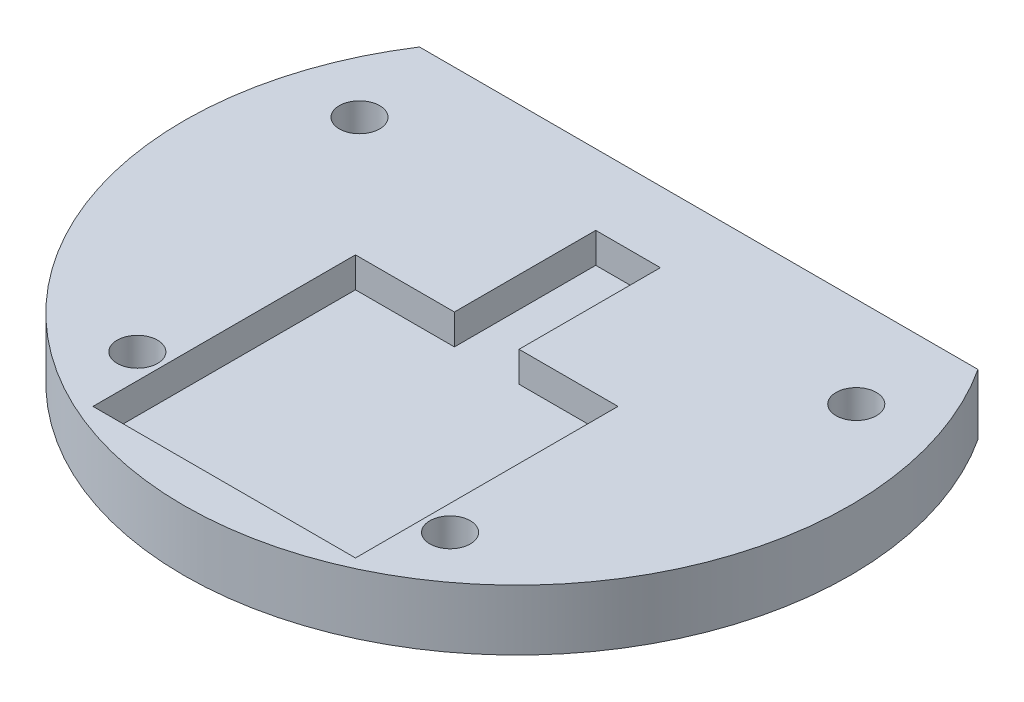
ISO-10303-21;
HEADER;
FILE_DESCRIPTION(('STEP AP214'),'2;1');
FILE_NAME('part.step','',(''),(''),'','','');
FILE_SCHEMA(('AUTOMOTIVE_DESIGN { 1 0 10303 214 1 1 1 1 }'));
ENDSEC;
DATA;
#1=APPLICATION_CONTEXT('core data for automotive mechanical design processes');
#2=APPLICATION_PROTOCOL_DEFINITION('international standard','automotive_design',2000,#1);
#3=PRODUCT_CONTEXT('',#1,'mechanical');
#4=PRODUCT('Part','Part','',(#3));
#5=PRODUCT_RELATED_PRODUCT_CATEGORY('part','',(#4));
#6=PRODUCT_DEFINITION_FORMATION('','',#4);
#7=PRODUCT_DEFINITION_CONTEXT('part definition',#1,'design');
#8=PRODUCT_DEFINITION('design','',#6,#7);
#9=PRODUCT_DEFINITION_SHAPE('','',#8);
#10=(LENGTH_UNIT() NAMED_UNIT(*) SI_UNIT(.MILLI.,.METRE.));
#11=(NAMED_UNIT(*) PLANE_ANGLE_UNIT() SI_UNIT($,.RADIAN.));
#12=(NAMED_UNIT(*) SI_UNIT($,.STERADIAN.) SOLID_ANGLE_UNIT());
#13=UNCERTAINTY_MEASURE_WITH_UNIT(LENGTH_MEASURE(1.E-05),#10,'distance_accuracy_value','');
#14=(GEOMETRIC_REPRESENTATION_CONTEXT(3) GLOBAL_UNCERTAINTY_ASSIGNED_CONTEXT((#13)) GLOBAL_UNIT_ASSIGNED_CONTEXT((#10,
#11,#12)) REPRESENTATION_CONTEXT('',''));
#15=CARTESIAN_POINT('',(0.,0.,0.));
#16=DIRECTION('',(0.,0.,1.));
#17=DIRECTION('',(1.,0.,0.));
#18=AXIS2_PLACEMENT_3D('',#15,#16,#17);
#19=CARTESIAN_POINT('',(6.5,1.5,1.5));
#20=DIRECTION('',(0.,0.,-1.));
#21=DIRECTION('',(-1.,0.,0.));
#22=AXIS2_PLACEMENT_3D('',#19,#20,#21);
#23=PLANE('',#22);
#24=DIRECTION('',(-1.,0.,0.));
#25=VECTOR('',#24,1.);
#26=CARTESIAN_POINT('',(6.5,3.,1.5));
#27=LINE('',#26,#25);
#28=CARTESIAN_POINT('',(6.5,3.,1.5));
#29=VERTEX_POINT('',#28);
#30=CARTESIAN_POINT('',(1.6,3.,1.5));
#31=VERTEX_POINT('',#30);
#32=EDGE_CURVE('E164',#29,#31,#27,.T.);
#33=ORIENTED_EDGE('',*,*,#32,.T.);
#34=DIRECTION('',(0.,1.,0.));
#35=VECTOR('',#34,1.);
#36=CARTESIAN_POINT('',(1.6,-6.19675256195754,1.5));
#37=LINE('',#36,#35);
#38=CARTESIAN_POINT('',(1.6,1.5,1.5));
#39=VERTEX_POINT('',#38);
#40=EDGE_CURVE('E186',#39,#31,#37,.T.);
#41=ORIENTED_EDGE('',*,*,#40,.F.);
#42=DIRECTION('',(-1.,0.,0.));
#43=VECTOR('',#42,1.);
#44=CARTESIAN_POINT('',(6.5,1.5,1.5));
#45=LINE('',#44,#43);
#46=CARTESIAN_POINT('',(6.5,1.5,1.5));
#47=VERTEX_POINT('',#46);
#48=EDGE_CURVE('E156',#47,#39,#45,.T.);
#49=ORIENTED_EDGE('',*,*,#48,.F.);
#50=DIRECTION('',(0.,1.,0.));
#51=VECTOR('',#50,1.);
#52=CARTESIAN_POINT('',(6.5,1.5,1.5));
#53=LINE('',#52,#51);
#54=EDGE_CURVE('E143',#47,#29,#53,.T.);
#55=ORIENTED_EDGE('',*,*,#54,.T.);
#56=EDGE_LOOP('',(#33,#41,#49,#55));
#57=FACE_BOUND('',#56,.T.);
#58=ADVANCED_FACE('F41',(#57),#23,.F.);
#59=CARTESIAN_POINT('',(0.,3.,0.));
#60=DIRECTION('',(0.,-1.,0.));
#61=DIRECTION('',(0.,0.,-1.));
#62=AXIS2_PLACEMENT_3D('',#59,#60,#61);
#63=CYLINDRICAL_SURFACE('',#62,16.5);
#64=CARTESIAN_POINT('',(0.,0.,0.));
#65=DIRECTION('',(0.,1.,0.));
#66=DIRECTION('',(0.,0.,1.));
#67=AXIS2_PLACEMENT_3D('',#64,#65,#66);
#68=CIRCLE('',#67,16.5);
#69=CARTESIAN_POINT('',(-13.8293166859393,0.,-9.));
#70=VERTEX_POINT('',#69);
#71=CARTESIAN_POINT('',(13.8293166859393,0.,-9.));
#72=VERTEX_POINT('',#71);
#73=EDGE_CURVE('E45',#70,#72,#68,.T.);
#74=ORIENTED_EDGE('',*,*,#73,.T.);
#75=DIRECTION('',(0.,1.,0.));
#76=VECTOR('',#75,1.);
#77=CARTESIAN_POINT('',(13.8293166859393,0.,-9.));
#78=LINE('',#77,#76);
#79=CARTESIAN_POINT('',(13.8293166859393,3.,-9.));
#80=VERTEX_POINT('',#79);
#81=EDGE_CURVE('E56',#72,#80,#78,.T.);
#82=ORIENTED_EDGE('',*,*,#81,.T.);
#83=CARTESIAN_POINT('',(0.,3.,0.));
#84=DIRECTION('',(0.,1.,0.));
#85=DIRECTION('',(0.,0.,1.));
#86=AXIS2_PLACEMENT_3D('',#83,#84,#85);
#87=CIRCLE('',#86,16.5);
#88=CARTESIAN_POINT('',(-13.8293166859393,3.,-9.));
#89=VERTEX_POINT('',#88);
#90=EDGE_CURVE('E11',#89,#80,#87,.T.);
#91=ORIENTED_EDGE('',*,*,#90,.F.);
#92=DIRECTION('',(0.,1.,0.));
#93=VECTOR('',#92,1.);
#94=CARTESIAN_POINT('',(-13.8293166859393,0.,-9.));
#95=LINE('',#94,#93);
#96=EDGE_CURVE('E118',#70,#89,#95,.T.);
#97=ORIENTED_EDGE('',*,*,#96,.F.);
#98=EDGE_LOOP('',(#74,#82,#91,#97));
#99=FACE_BOUND('',#98,.T.);
#100=ADVANCED_FACE('F43',(#99),#63,.T.);
#101=CARTESIAN_POINT('',(0.,3.,0.));
#102=DIRECTION('',(0.,1.,0.));
#103=DIRECTION('',(0.,0.,1.));
#104=AXIS2_PLACEMENT_3D('',#101,#102,#103);
#105=PLANE('',#104);
#106=DIRECTION('',(1.,0.,0.));
#107=VECTOR('',#106,1.);
#108=CARTESIAN_POINT('',(13.8293166859393,3.,-9.));
#109=LINE('',#108,#107);
#110=EDGE_CURVE('E123',#89,#80,#109,.T.);
#111=ORIENTED_EDGE('',*,*,#110,.F.);
#112=ORIENTED_EDGE('',*,*,#90,.T.);
#113=EDGE_LOOP('',(#111,#112));
#114=FACE_BOUND('',#113,.T.);
#115=CARTESIAN_POINT('',(12.3,3.,-4.50000000000001));
#116=DIRECTION('',(0.,-1.,0.));
#117=DIRECTION('',(0.,0.,-1.));
#118=AXIS2_PLACEMENT_3D('',#115,#116,#117);
#119=CIRCLE('',#118,1.);
#120=CARTESIAN_POINT('',(12.3,3.,-5.50000000000002));
#121=VERTEX_POINT('',#120);
#122=EDGE_CURVE('E250',#121,#121,#119,.T.);
#123=ORIENTED_EDGE('',*,*,#122,.T.);
#124=EDGE_LOOP('',(#123));
#125=FACE_BOUND('',#124,.T.);
#126=CARTESIAN_POINT('',(-12.3,3.,-4.50000000000001));
#127=DIRECTION('',(0.,-1.,0.));
#128=DIRECTION('',(0.,0.,-1.));
#129=AXIS2_PLACEMENT_3D('',#126,#127,#128);
#130=CIRCLE('',#129,1.);
#131=CARTESIAN_POINT('',(-12.3,3.,-5.50000000000001));
#132=VERTEX_POINT('',#131);
#133=EDGE_CURVE('E253',#132,#132,#130,.T.);
#134=ORIENTED_EDGE('',*,*,#133,.T.);
#135=EDGE_LOOP('',(#134));
#136=FACE_BOUND('',#135,.T.);
#137=CARTESIAN_POINT('',(-7.74328189073907,3.,11.0585525979015));
#138=DIRECTION('',(0.,-1.,0.));
#139=DIRECTION('',(0.,0.,-1.));
#140=AXIS2_PLACEMENT_3D('',#137,#138,#139);
#141=CIRCLE('',#140,0.999999999999999);
#142=CARTESIAN_POINT('',(-7.74328189073907,3.,10.0585525979015));
#143=VERTEX_POINT('',#142);
#144=EDGE_CURVE('E249',#143,#143,#141,.T.);
#145=ORIENTED_EDGE('',*,*,#144,.T.);
#146=EDGE_LOOP('',(#145));
#147=FACE_BOUND('',#146,.T.);
#148=CARTESIAN_POINT('',(7.74328189073917,3.,11.0585525979014));
#149=DIRECTION('',(0.,-1.,0.));
#150=DIRECTION('',(0.,0.,-1.));
#151=AXIS2_PLACEMENT_3D('',#148,#149,#150);
#152=CIRCLE('',#151,0.999999999999999);
#153=CARTESIAN_POINT('',(7.74328189073917,3.,10.0585525979014));
#154=VERTEX_POINT('',#153);
#155=EDGE_CURVE('E246',#154,#154,#152,.T.);
#156=ORIENTED_EDGE('',*,*,#155,.T.);
#157=EDGE_LOOP('',(#156));
#158=FACE_BOUND('',#157,.T.);
#159=DIRECTION('',(0.,0.,-1.));
#160=VECTOR('',#159,1.);
#161=CARTESIAN_POINT('',(1.6,3.,1.5));
#162=LINE('',#161,#160);
#163=CARTESIAN_POINT('',(1.6,3.,-5.5));
#164=VERTEX_POINT('',#163);
#165=EDGE_CURVE('E204',#31,#164,#162,.T.);
#166=ORIENTED_EDGE('',*,*,#165,.F.);
#167=ORIENTED_EDGE('',*,*,#32,.F.);
#168=DIRECTION('',(0.,0.,-1.));
#169=VECTOR('',#168,1.);
#170=CARTESIAN_POINT('',(6.5,3.,14.5));
#171=LINE('',#170,#169);
#172=CARTESIAN_POINT('',(6.5,3.,14.5));
#173=VERTEX_POINT('',#172);
#174=EDGE_CURVE('E160',#173,#29,#171,.T.);
#175=ORIENTED_EDGE('',*,*,#174,.F.);
#176=DIRECTION('',(-1.,0.,0.));
#177=VECTOR('',#176,1.);
#178=CARTESIAN_POINT('',(6.5,3.,14.5));
#179=LINE('',#178,#177);
#180=CARTESIAN_POINT('',(-6.5,3.,14.5));
#181=VERTEX_POINT('',#180);
#182=EDGE_CURVE('E138',#173,#181,#179,.T.);
#183=ORIENTED_EDGE('',*,*,#182,.T.);
#184=DIRECTION('',(0.,0.,-1.));
#185=VECTOR('',#184,1.);
#186=CARTESIAN_POINT('',(-6.5,3.,14.5));
#187=LINE('',#186,#185);
#188=CARTESIAN_POINT('',(-6.5,3.,1.5));
#189=VERTEX_POINT('',#188);
#190=EDGE_CURVE('E165',#181,#189,#187,.T.);
#191=ORIENTED_EDGE('',*,*,#190,.T.);
#192=CARTESIAN_POINT('',(-1.6,3.,1.5));
#193=VERTEX_POINT('',#192);
#194=EDGE_CURVE('E162',#193,#189,#27,.T.);
#195=ORIENTED_EDGE('',*,*,#194,.F.);
#196=DIRECTION('',(0.,0.,1.));
#197=VECTOR('',#196,1.);
#198=CARTESIAN_POINT('',(-1.6,3.,1.5));
#199=LINE('',#198,#197);
#200=CARTESIAN_POINT('',(-1.6,3.,-5.5));
#201=VERTEX_POINT('',#200);
#202=EDGE_CURVE('E196',#201,#193,#199,.T.);
#203=ORIENTED_EDGE('',*,*,#202,.F.);
#204=DIRECTION('',(-1.,0.,0.));
#205=VECTOR('',#204,1.);
#206=CARTESIAN_POINT('',(1.6,3.,-5.5));
#207=LINE('',#206,#205);
#208=EDGE_CURVE('E202',#164,#201,#207,.T.);
#209=ORIENTED_EDGE('',*,*,#208,.F.);
#210=EDGE_LOOP('',(#166,#167,#175,#183,#191,#195,#203,#209));
#211=FACE_BOUND('',#210,.T.);
#212=ADVANCED_FACE('F260',(#114,#125,#136,#147,#158,#211),#105,.T.);
#213=CARTESIAN_POINT('',(0.,0.,0.));
#214=DIRECTION('',(0.,1.,0.));
#215=DIRECTION('',(0.,0.,1.));
#216=AXIS2_PLACEMENT_3D('',#213,#214,#215);
#217=PLANE('',#216);
#218=CARTESIAN_POINT('',(12.3,0.,-4.50000000000001));
#219=DIRECTION('',(0.,-1.,0.));
#220=DIRECTION('',(0.,0.,-1.));
#221=AXIS2_PLACEMENT_3D('',#218,#219,#220);
#222=CIRCLE('',#221,1.5);
#223=CARTESIAN_POINT('',(12.3,0.,-6.00000000000001));
#224=VERTEX_POINT('',#223);
#225=EDGE_CURVE('E220',#224,#224,#222,.T.);
#226=ORIENTED_EDGE('',*,*,#225,.F.);
#227=EDGE_LOOP('',(#226));
#228=FACE_BOUND('',#227,.T.);
#229=CARTESIAN_POINT('',(-12.3,0.,-4.50000000000001));
#230=DIRECTION('',(0.,-1.,0.));
#231=DIRECTION('',(0.,0.,-1.));
#232=AXIS2_PLACEMENT_3D('',#229,#230,#231);
#233=CIRCLE('',#232,1.5);
#234=CARTESIAN_POINT('',(-12.3,0.,-6.00000000000001));
#235=VERTEX_POINT('',#234);
#236=EDGE_CURVE('E227',#235,#235,#233,.T.);
#237=ORIENTED_EDGE('',*,*,#236,.F.);
#238=EDGE_LOOP('',(#237));
#239=FACE_BOUND('',#238,.T.);
#240=CARTESIAN_POINT('',(-7.74328189073907,0.,11.0585525979015));
#241=DIRECTION('',(0.,-1.,0.));
#242=DIRECTION('',(0.,0.,-1.));
#243=AXIS2_PLACEMENT_3D('',#240,#241,#242);
#244=CIRCLE('',#243,1.5);
#245=CARTESIAN_POINT('',(-7.74328189073907,0.,9.55855259790145));
#246=VERTEX_POINT('',#245);
#247=EDGE_CURVE('E214',#246,#246,#244,.T.);
#248=ORIENTED_EDGE('',*,*,#247,.F.);
#249=EDGE_LOOP('',(#248));
#250=FACE_BOUND('',#249,.T.);
#251=CARTESIAN_POINT('',(7.74328189073917,0.,11.0585525979014));
#252=DIRECTION('',(0.,-1.,0.));
#253=DIRECTION('',(0.,0.,-1.));
#254=AXIS2_PLACEMENT_3D('',#251,#252,#253);
#255=CIRCLE('',#254,1.5);
#256=CARTESIAN_POINT('',(7.74328189073917,0.,9.55855259790141));
#257=VERTEX_POINT('',#256);
#258=EDGE_CURVE('E211',#257,#257,#255,.T.);
#259=ORIENTED_EDGE('',*,*,#258,.F.);
#260=EDGE_LOOP('',(#259));
#261=FACE_BOUND('',#260,.T.);
#262=ORIENTED_EDGE('',*,*,#73,.F.);
#263=DIRECTION('',(1.,0.,0.));
#264=VECTOR('',#263,1.);
#265=CARTESIAN_POINT('',(13.8293166859393,0.,-9.));
#266=LINE('',#265,#264);
#267=EDGE_CURVE('E115',#70,#72,#266,.T.);
#268=ORIENTED_EDGE('',*,*,#267,.T.);
#269=EDGE_LOOP('',(#262,#268));
#270=FACE_BOUND('',#269,.T.);
#271=ADVANCED_FACE('F128',(#228,#239,#250,#261,#270),#217,.F.);
#272=CARTESIAN_POINT('',(6.5,1.5,14.5));
#273=DIRECTION('',(1.,0.,0.));
#274=DIRECTION('',(0.,0.,-1.));
#275=AXIS2_PLACEMENT_3D('',#272,#273,#274);
#276=PLANE('',#275);
#277=ORIENTED_EDGE('',*,*,#174,.T.);
#278=ORIENTED_EDGE('',*,*,#54,.F.);
#279=DIRECTION('',(0.,0.,-1.));
#280=VECTOR('',#279,1.);
#281=CARTESIAN_POINT('',(6.5,1.5,14.5));
#282=LINE('',#281,#280);
#283=CARTESIAN_POINT('',(6.5,1.5,14.5));
#284=VERTEX_POINT('',#283);
#285=EDGE_CURVE('E171',#284,#47,#282,.T.);
#286=ORIENTED_EDGE('',*,*,#285,.F.);
#287=DIRECTION('',(0.,1.,0.));
#288=VECTOR('',#287,1.);
#289=CARTESIAN_POINT('',(6.5,1.5,14.5));
#290=LINE('',#289,#288);
#291=EDGE_CURVE('E129',#284,#173,#290,.T.);
#292=ORIENTED_EDGE('',*,*,#291,.T.);
#293=EDGE_LOOP('',(#277,#278,#286,#292));
#294=FACE_BOUND('',#293,.T.);
#295=ADVANCED_FACE('F302',(#294),#276,.F.);
#296=CARTESIAN_POINT('',(6.5,1.5,14.5));
#297=DIRECTION('',(0.,0.,-1.));
#298=DIRECTION('',(-1.,0.,0.));
#299=AXIS2_PLACEMENT_3D('',#296,#297,#298);
#300=PLANE('',#299);
#301=ORIENTED_EDGE('',*,*,#182,.F.);
#302=ORIENTED_EDGE('',*,*,#291,.F.);
#303=DIRECTION('',(-1.,0.,0.));
#304=VECTOR('',#303,1.);
#305=CARTESIAN_POINT('',(6.5,1.5,14.5));
#306=LINE('',#305,#304);
#307=CARTESIAN_POINT('',(-6.5,1.5,14.5));
#308=VERTEX_POINT('',#307);
#309=EDGE_CURVE('E145',#284,#308,#306,.T.);
#310=ORIENTED_EDGE('',*,*,#309,.T.);
#311=DIRECTION('',(0.,1.,0.));
#312=VECTOR('',#311,1.);
#313=CARTESIAN_POINT('',(-6.5,1.5,14.5));
#314=LINE('',#313,#312);
#315=EDGE_CURVE('E130',#308,#181,#314,.T.);
#316=ORIENTED_EDGE('',*,*,#315,.T.);
#317=EDGE_LOOP('',(#301,#302,#310,#316));
#318=FACE_BOUND('',#317,.T.);
#319=ADVANCED_FACE('F297',(#318),#300,.T.);
#320=CARTESIAN_POINT('',(-6.5,1.5,14.5));
#321=DIRECTION('',(1.,0.,0.));
#322=DIRECTION('',(0.,0.,-1.));
#323=AXIS2_PLACEMENT_3D('',#320,#321,#322);
#324=PLANE('',#323);
#325=ORIENTED_EDGE('',*,*,#190,.F.);
#326=ORIENTED_EDGE('',*,*,#315,.F.);
#327=DIRECTION('',(0.,0.,-1.));
#328=VECTOR('',#327,1.);
#329=CARTESIAN_POINT('',(-6.5,1.5,14.5));
#330=LINE('',#329,#328);
#331=CARTESIAN_POINT('',(-6.5,1.5,1.5));
#332=VERTEX_POINT('',#331);
#333=EDGE_CURVE('E150',#308,#332,#330,.T.);
#334=ORIENTED_EDGE('',*,*,#333,.T.);
#335=DIRECTION('',(0.,1.,0.));
#336=VECTOR('',#335,1.);
#337=CARTESIAN_POINT('',(-6.5,1.5,1.5));
#338=LINE('',#337,#336);
#339=EDGE_CURVE('E135',#332,#189,#338,.T.);
#340=ORIENTED_EDGE('',*,*,#339,.T.);
#341=EDGE_LOOP('',(#325,#326,#334,#340));
#342=FACE_BOUND('',#341,.T.);
#343=ADVANCED_FACE('F292',(#342),#324,.T.);
#344=CARTESIAN_POINT('',(-1.6,1.5,1.5));
#345=VERTEX_POINT('',#344);
#346=EDGE_CURVE('E174',#345,#332,#45,.T.);
#347=ORIENTED_EDGE('',*,*,#346,.F.);
#348=DIRECTION('',(0.,1.,0.));
#349=VECTOR('',#348,1.);
#350=CARTESIAN_POINT('',(-1.6,-6.19675256195754,1.5));
#351=LINE('',#350,#349);
#352=EDGE_CURVE('E64',#345,#193,#351,.T.);
#353=ORIENTED_EDGE('',*,*,#352,.T.);
#354=ORIENTED_EDGE('',*,*,#194,.T.);
#355=ORIENTED_EDGE('',*,*,#339,.F.);
#356=EDGE_LOOP('',(#347,#353,#354,#355));
#357=FACE_BOUND('',#356,.T.);
#358=ADVANCED_FACE('F281',(#357),#23,.F.);
#359=CARTESIAN_POINT('',(0.,1.5,0.));
#360=DIRECTION('',(0.,1.,0.));
#361=DIRECTION('',(0.,0.,1.));
#362=AXIS2_PLACEMENT_3D('',#359,#360,#361);
#363=PLANE('',#362);
#364=ORIENTED_EDGE('',*,*,#285,.T.);
#365=ORIENTED_EDGE('',*,*,#48,.T.);
#366=DIRECTION('',(0.,0.,1.));
#367=VECTOR('',#366,1.);
#368=CARTESIAN_POINT('',(1.6,1.5,1.5));
#369=LINE('',#368,#367);
#370=CARTESIAN_POINT('',(1.6,1.5,-5.5));
#371=VERTEX_POINT('',#370);
#372=EDGE_CURVE('E183',#371,#39,#369,.T.);
#373=ORIENTED_EDGE('',*,*,#372,.F.);
#374=DIRECTION('',(1.,0.,0.));
#375=VECTOR('',#374,1.);
#376=CARTESIAN_POINT('',(1.6,1.5,-5.5));
#377=LINE('',#376,#375);
#378=CARTESIAN_POINT('',(-1.6,1.5,-5.5));
#379=VERTEX_POINT('',#378);
#380=EDGE_CURVE('E163',#379,#371,#377,.T.);
#381=ORIENTED_EDGE('',*,*,#380,.F.);
#382=DIRECTION('',(0.,0.,-1.));
#383=VECTOR('',#382,1.);
#384=CARTESIAN_POINT('',(-1.6,1.5,1.5));
#385=LINE('',#384,#383);
#386=EDGE_CURVE('E190',#345,#379,#385,.T.);
#387=ORIENTED_EDGE('',*,*,#386,.F.);
#388=ORIENTED_EDGE('',*,*,#346,.T.);
#389=ORIENTED_EDGE('',*,*,#333,.F.);
#390=ORIENTED_EDGE('',*,*,#309,.F.);
#391=EDGE_LOOP('',(#364,#365,#373,#381,#387,#388,#389,#390));
#392=FACE_BOUND('',#391,.T.);
#393=ADVANCED_FACE('F181',(#392),#363,.T.);
#394=CARTESIAN_POINT('',(1.6,-6.19675256195754,1.5));
#395=DIRECTION('',(1.,0.,0.));
#396=DIRECTION('',(0.,0.,-1.));
#397=AXIS2_PLACEMENT_3D('',#394,#395,#396);
#398=PLANE('',#397);
#399=ORIENTED_EDGE('',*,*,#372,.T.);
#400=ORIENTED_EDGE('',*,*,#40,.T.);
#401=ORIENTED_EDGE('',*,*,#165,.T.);
#402=DIRECTION('',(0.,1.,0.));
#403=VECTOR('',#402,1.);
#404=CARTESIAN_POINT('',(1.6,-6.19675256195754,-5.5));
#405=LINE('',#404,#403);
#406=EDGE_CURVE('E199',#371,#164,#405,.T.);
#407=ORIENTED_EDGE('',*,*,#406,.F.);
#408=EDGE_LOOP('',(#399,#400,#401,#407));
#409=FACE_BOUND('',#408,.T.);
#410=ADVANCED_FACE('F271',(#409),#398,.F.);
#411=CARTESIAN_POINT('',(-1.6,-6.19675256195754,1.5));
#412=DIRECTION('',(-1.,0.,0.));
#413=DIRECTION('',(0.,0.,1.));
#414=AXIS2_PLACEMENT_3D('',#411,#412,#413);
#415=PLANE('',#414);
#416=ORIENTED_EDGE('',*,*,#386,.T.);
#417=DIRECTION('',(0.,1.,0.));
#418=VECTOR('',#417,1.);
#419=CARTESIAN_POINT('',(-1.6,-6.19675256195754,-5.5));
#420=LINE('',#419,#418);
#421=EDGE_CURVE('E193',#379,#201,#420,.T.);
#422=ORIENTED_EDGE('',*,*,#421,.T.);
#423=ORIENTED_EDGE('',*,*,#202,.T.);
#424=ORIENTED_EDGE('',*,*,#352,.F.);
#425=EDGE_LOOP('',(#416,#422,#423,#424));
#426=FACE_BOUND('',#425,.T.);
#427=ADVANCED_FACE('F273',(#426),#415,.F.);
#428=CARTESIAN_POINT('',(1.6,-6.19675256195754,-5.5));
#429=DIRECTION('',(0.,0.,-1.));
#430=DIRECTION('',(-1.,0.,0.));
#431=AXIS2_PLACEMENT_3D('',#428,#429,#430);
#432=PLANE('',#431);
#433=ORIENTED_EDGE('',*,*,#380,.T.);
#434=ORIENTED_EDGE('',*,*,#406,.T.);
#435=ORIENTED_EDGE('',*,*,#208,.T.);
#436=ORIENTED_EDGE('',*,*,#421,.F.);
#437=EDGE_LOOP('',(#433,#434,#435,#436));
#438=FACE_BOUND('',#437,.T.);
#439=ADVANCED_FACE('F279',(#438),#432,.F.);
#440=CARTESIAN_POINT('',(7.74328189073917,1.,11.0585525979014));
#441=DIRECTION('',(0.,-1.,0.));
#442=DIRECTION('',(0.,0.,-1.));
#443=AXIS2_PLACEMENT_3D('',#440,#441,#442);
#444=CYLINDRICAL_SURFACE('',#443,1.5);
#445=CARTESIAN_POINT('',(7.74328189073917,1.,11.0585525979014));
#446=DIRECTION('',(0.,-1.,0.));
#447=DIRECTION('',(0.,0.,-1.));
#448=AXIS2_PLACEMENT_3D('',#445,#446,#447);
#449=CIRCLE('',#448,1.5);
#450=CARTESIAN_POINT('',(7.74328189073917,1.,9.55855259790141));
#451=VERTEX_POINT('',#450);
#452=EDGE_CURVE('E207',#451,#451,#449,.T.);
#453=ORIENTED_EDGE('',*,*,#452,.F.);
#454=EDGE_LOOP('',(#453));
#455=FACE_BOUND('',#454,.T.);
#456=ORIENTED_EDGE('',*,*,#258,.T.);
#457=EDGE_LOOP('',(#456));
#458=FACE_BOUND('',#457,.T.);
#459=ADVANCED_FACE('F320',(#455,#458),#444,.F.);
#460=CARTESIAN_POINT('',(7.74328189073917,1.,11.0585525979014));
#461=DIRECTION('',(0.,-1.,0.));
#462=DIRECTION('',(0.,0.,-1.));
#463=AXIS2_PLACEMENT_3D('',#460,#461,#462);
#464=PLANE('',#463);
#465=CARTESIAN_POINT('',(7.74328189073917,1.,11.0585525979014));
#466=DIRECTION('',(0.,-1.,0.));
#467=DIRECTION('',(0.,0.,-1.));
#468=AXIS2_PLACEMENT_3D('',#465,#466,#467);
#469=CIRCLE('',#468,0.999999999999999);
#470=CARTESIAN_POINT('',(7.74328189073917,1.,10.0585525979014));
#471=VERTEX_POINT('',#470);
#472=EDGE_CURVE('E221',#471,#471,#469,.T.);
#473=ORIENTED_EDGE('',*,*,#472,.F.);
#474=EDGE_LOOP('',(#473));
#475=FACE_BOUND('',#474,.T.);
#476=ORIENTED_EDGE('',*,*,#452,.T.);
#477=EDGE_LOOP('',(#476));
#478=FACE_BOUND('',#477,.T.);
#479=ADVANCED_FACE('F322',(#475,#478),#464,.T.);
#480=CARTESIAN_POINT('',(-7.74328189073907,1.,11.0585525979015));
#481=DIRECTION('',(0.,-1.,0.));
#482=DIRECTION('',(0.,0.,-1.));
#483=AXIS2_PLACEMENT_3D('',#480,#481,#482);
#484=CYLINDRICAL_SURFACE('',#483,1.5);
#485=CARTESIAN_POINT('',(-7.74328189073907,1.,11.0585525979015));
#486=DIRECTION('',(0.,-1.,0.));
#487=DIRECTION('',(0.,0.,-1.));
#488=AXIS2_PLACEMENT_3D('',#485,#486,#487);
#489=CIRCLE('',#488,1.5);
#490=CARTESIAN_POINT('',(-7.74328189073907,1.,9.55855259790145));
#491=VERTEX_POINT('',#490);
#492=EDGE_CURVE('E230',#491,#491,#489,.T.);
#493=ORIENTED_EDGE('',*,*,#492,.F.);
#494=EDGE_LOOP('',(#493));
#495=FACE_BOUND('',#494,.T.);
#496=ORIENTED_EDGE('',*,*,#247,.T.);
#497=EDGE_LOOP('',(#496));
#498=FACE_BOUND('',#497,.T.);
#499=ADVANCED_FACE('F329',(#495,#498),#484,.F.);
#500=CARTESIAN_POINT('',(-7.74328189073907,1.,11.0585525979015));
#501=DIRECTION('',(0.,-1.,0.));
#502=DIRECTION('',(0.,0.,-1.));
#503=AXIS2_PLACEMENT_3D('',#500,#501,#502);
#504=PLANE('',#503);
#505=CARTESIAN_POINT('',(-7.74328189073907,1.,11.0585525979015));
#506=DIRECTION('',(0.,-1.,0.));
#507=DIRECTION('',(0.,0.,-1.));
#508=AXIS2_PLACEMENT_3D('',#505,#506,#507);
#509=CIRCLE('',#508,0.999999999999999);
#510=CARTESIAN_POINT('',(-7.74328189073907,1.,10.0585525979015));
#511=VERTEX_POINT('',#510);
#512=EDGE_CURVE('E237',#511,#511,#509,.T.);
#513=ORIENTED_EDGE('',*,*,#512,.F.);
#514=EDGE_LOOP('',(#513));
#515=FACE_BOUND('',#514,.T.);
#516=ORIENTED_EDGE('',*,*,#492,.T.);
#517=EDGE_LOOP('',(#516));
#518=FACE_BOUND('',#517,.T.);
#519=ADVANCED_FACE('F350',(#515,#518),#504,.T.);
#520=CARTESIAN_POINT('',(-12.3,1.,-4.50000000000001));
#521=DIRECTION('',(0.,-1.,0.));
#522=DIRECTION('',(0.,0.,-1.));
#523=AXIS2_PLACEMENT_3D('',#520,#521,#522);
#524=CYLINDRICAL_SURFACE('',#523,1.5);
#525=CARTESIAN_POINT('',(-12.3,1.,-4.50000000000001));
#526=DIRECTION('',(0.,-1.,0.));
#527=DIRECTION('',(0.,0.,-1.));
#528=AXIS2_PLACEMENT_3D('',#525,#526,#527);
#529=CIRCLE('',#528,1.5);
#530=CARTESIAN_POINT('',(-12.3,1.,-6.00000000000001));
#531=VERTEX_POINT('',#530);
#532=EDGE_CURVE('E224',#531,#531,#529,.T.);
#533=ORIENTED_EDGE('',*,*,#532,.F.);
#534=EDGE_LOOP('',(#533));
#535=FACE_BOUND('',#534,.T.);
#536=ORIENTED_EDGE('',*,*,#236,.T.);
#537=EDGE_LOOP('',(#536));
#538=FACE_BOUND('',#537,.T.);
#539=ADVANCED_FACE('F346',(#535,#538),#524,.F.);
#540=CARTESIAN_POINT('',(-12.3,1.,-4.50000000000001));
#541=DIRECTION('',(0.,-1.,0.));
#542=DIRECTION('',(0.,0.,-1.));
#543=AXIS2_PLACEMENT_3D('',#540,#541,#542);
#544=PLANE('',#543);
#545=CARTESIAN_POINT('',(-12.3,1.,-4.50000000000001));
#546=DIRECTION('',(0.,-1.,0.));
#547=DIRECTION('',(0.,0.,-1.));
#548=AXIS2_PLACEMENT_3D('',#545,#546,#547);
#549=CIRCLE('',#548,1.);
#550=CARTESIAN_POINT('',(-12.3,1.,-5.50000000000001));
#551=VERTEX_POINT('',#550);
#552=EDGE_CURVE('E240',#551,#551,#549,.T.);
#553=ORIENTED_EDGE('',*,*,#552,.F.);
#554=EDGE_LOOP('',(#553));
#555=FACE_BOUND('',#554,.T.);
#556=ORIENTED_EDGE('',*,*,#532,.T.);
#557=EDGE_LOOP('',(#556));
#558=FACE_BOUND('',#557,.T.);
#559=ADVANCED_FACE('F342',(#555,#558),#544,.T.);
#560=CARTESIAN_POINT('',(12.3,1.,-4.50000000000001));
#561=DIRECTION('',(0.,-1.,0.));
#562=DIRECTION('',(0.,0.,-1.));
#563=AXIS2_PLACEMENT_3D('',#560,#561,#562);
#564=CYLINDRICAL_SURFACE('',#563,1.5);
#565=CARTESIAN_POINT('',(12.3,1.,-4.50000000000001));
#566=DIRECTION('',(0.,-1.,0.));
#567=DIRECTION('',(0.,0.,-1.));
#568=AXIS2_PLACEMENT_3D('',#565,#566,#567);
#569=CIRCLE('',#568,1.5);
#570=CARTESIAN_POINT('',(12.3,1.,-6.00000000000001));
#571=VERTEX_POINT('',#570);
#572=EDGE_CURVE('E217',#571,#571,#569,.T.);
#573=ORIENTED_EDGE('',*,*,#572,.F.);
#574=EDGE_LOOP('',(#573));
#575=FACE_BOUND('',#574,.T.);
#576=ORIENTED_EDGE('',*,*,#225,.T.);
#577=EDGE_LOOP('',(#576));
#578=FACE_BOUND('',#577,.T.);
#579=ADVANCED_FACE('F338',(#575,#578),#564,.F.);
#580=CARTESIAN_POINT('',(12.3,1.,-4.50000000000001));
#581=DIRECTION('',(0.,-1.,0.));
#582=DIRECTION('',(0.,0.,-1.));
#583=AXIS2_PLACEMENT_3D('',#580,#581,#582);
#584=PLANE('',#583);
#585=CARTESIAN_POINT('',(12.3,1.,-4.50000000000001));
#586=DIRECTION('',(0.,-1.,0.));
#587=DIRECTION('',(0.,0.,-1.));
#588=AXIS2_PLACEMENT_3D('',#585,#586,#587);
#589=CIRCLE('',#588,1.);
#590=CARTESIAN_POINT('',(12.3,1.,-5.50000000000002));
#591=VERTEX_POINT('',#590);
#592=EDGE_CURVE('E243',#591,#591,#589,.T.);
#593=ORIENTED_EDGE('',*,*,#592,.F.);
#594=EDGE_LOOP('',(#593));
#595=FACE_BOUND('',#594,.T.);
#596=ORIENTED_EDGE('',*,*,#572,.T.);
#597=EDGE_LOOP('',(#596));
#598=FACE_BOUND('',#597,.T.);
#599=ADVANCED_FACE('F334',(#595,#598),#584,.T.);
#600=CARTESIAN_POINT('',(12.3,3.,-4.50000000000001));
#601=DIRECTION('',(0.,-1.,0.));
#602=DIRECTION('',(0.,0.,-1.));
#603=AXIS2_PLACEMENT_3D('',#600,#601,#602);
#604=CYLINDRICAL_SURFACE('',#603,1.);
#605=ORIENTED_EDGE('',*,*,#592,.T.);
#606=EDGE_LOOP('',(#605));
#607=FACE_BOUND('',#606,.T.);
#608=ORIENTED_EDGE('',*,*,#122,.F.);
#609=EDGE_LOOP('',(#608));
#610=FACE_BOUND('',#609,.T.);
#611=ADVANCED_FACE('F337',(#607,#610),#604,.F.);
#612=CARTESIAN_POINT('',(-12.3,3.,-4.50000000000001));
#613=DIRECTION('',(0.,-1.,0.));
#614=DIRECTION('',(0.,0.,-1.));
#615=AXIS2_PLACEMENT_3D('',#612,#613,#614);
#616=CYLINDRICAL_SURFACE('',#615,1.);
#617=ORIENTED_EDGE('',*,*,#552,.T.);
#618=EDGE_LOOP('',(#617));
#619=FACE_BOUND('',#618,.T.);
#620=ORIENTED_EDGE('',*,*,#133,.F.);
#621=EDGE_LOOP('',(#620));
#622=FACE_BOUND('',#621,.T.);
#623=ADVANCED_FACE('F365',(#619,#622),#616,.F.);
#624=CARTESIAN_POINT('',(-7.74328189073907,3.,11.0585525979015));
#625=DIRECTION('',(0.,-1.,0.));
#626=DIRECTION('',(0.,0.,-1.));
#627=AXIS2_PLACEMENT_3D('',#624,#625,#626);
#628=CYLINDRICAL_SURFACE('',#627,0.999999999999999);
#629=ORIENTED_EDGE('',*,*,#512,.T.);
#630=EDGE_LOOP('',(#629));
#631=FACE_BOUND('',#630,.T.);
#632=ORIENTED_EDGE('',*,*,#144,.F.);
#633=EDGE_LOOP('',(#632));
#634=FACE_BOUND('',#633,.T.);
#635=ADVANCED_FACE('F361',(#631,#634),#628,.F.);
#636=CARTESIAN_POINT('',(7.74328189073917,3.,11.0585525979014));
#637=DIRECTION('',(0.,-1.,0.));
#638=DIRECTION('',(0.,0.,-1.));
#639=AXIS2_PLACEMENT_3D('',#636,#637,#638);
#640=CYLINDRICAL_SURFACE('',#639,0.999999999999999);
#641=ORIENTED_EDGE('',*,*,#472,.T.);
#642=EDGE_LOOP('',(#641));
#643=FACE_BOUND('',#642,.T.);
#644=ORIENTED_EDGE('',*,*,#155,.F.);
#645=EDGE_LOOP('',(#644));
#646=FACE_BOUND('',#645,.T.);
#647=ADVANCED_FACE('F358',(#643,#646),#640,.F.);
#648=CARTESIAN_POINT('',(13.8293166859393,0.,-9.));
#649=DIRECTION('',(0.,0.,1.));
#650=DIRECTION('',(1.,0.,0.));
#651=AXIS2_PLACEMENT_3D('',#648,#649,#650);
#652=PLANE('',#651);
#653=ORIENTED_EDGE('',*,*,#110,.T.);
#654=ORIENTED_EDGE('',*,*,#81,.F.);
#655=ORIENTED_EDGE('',*,*,#267,.F.);
#656=ORIENTED_EDGE('',*,*,#96,.T.);
#657=EDGE_LOOP('',(#653,#654,#655,#656));
#658=FACE_BOUND('',#657,.T.);
#659=ADVANCED_FACE('F117',(#658),#652,.F.);
#660=CLOSED_SHELL('',(#58,#100,#212,#271,#295,#319,#343,#358,#393,#410,#427,#439,#459,#479,#499,
#519,#539,#559,#579,#599,#611,#623,#635,#647,#659));
#661=MANIFOLD_SOLID_BREP('B2',#660);
#662=ADVANCED_BREP_SHAPE_REPRESENTATION('',(#18,#661),#14);
#663=SHAPE_DEFINITION_REPRESENTATION(#9,#662);
ENDSEC;
END-ISO-10303-21;
